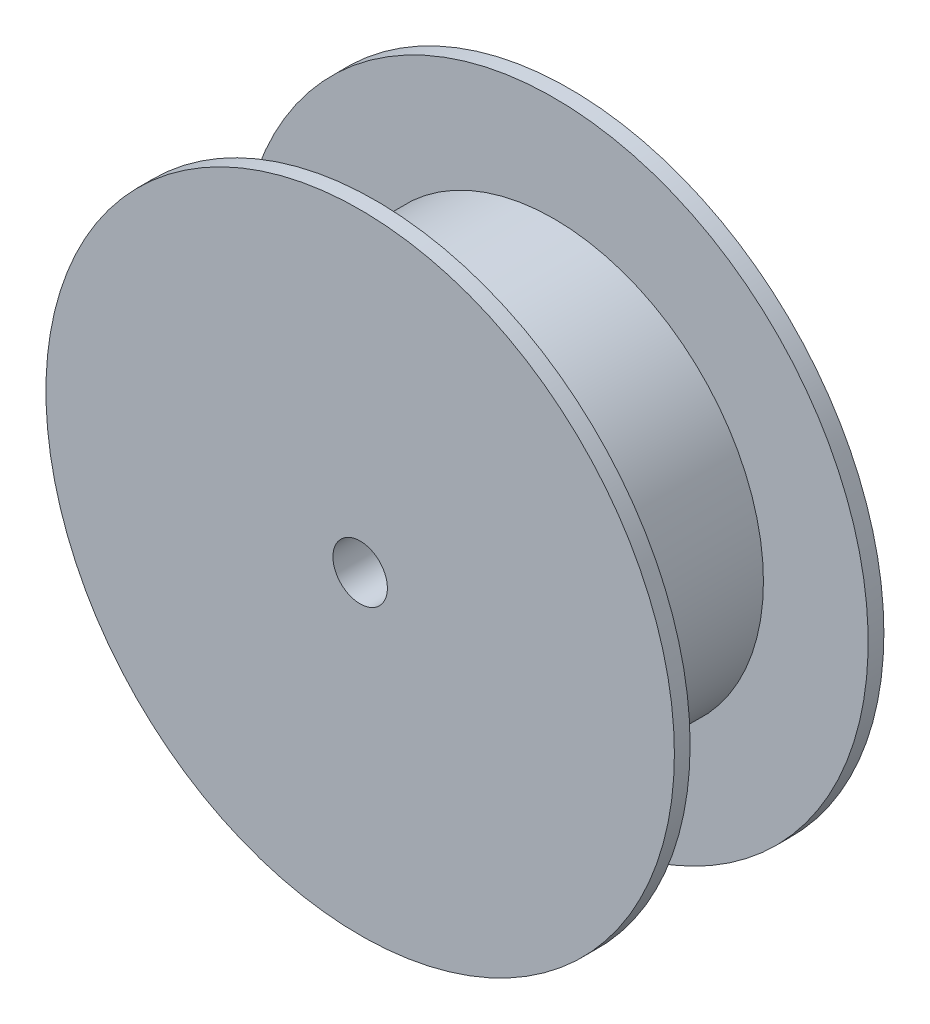
ISO-10303-21;
HEADER;
FILE_DESCRIPTION(('STEP AP214'),'2;1');
FILE_NAME('part.step','',(''),(''),'','','');
FILE_SCHEMA(('AUTOMOTIVE_DESIGN { 1 0 10303 214 1 1 1 1 }'));
ENDSEC;
DATA;
#1=APPLICATION_CONTEXT('core data for automotive mechanical design processes');
#2=APPLICATION_PROTOCOL_DEFINITION('international standard','automotive_design',2000,#1);
#3=PRODUCT_CONTEXT('',#1,'mechanical');
#4=PRODUCT('Part','Part','',(#3));
#5=PRODUCT_RELATED_PRODUCT_CATEGORY('part','',(#4));
#6=PRODUCT_DEFINITION_FORMATION('','',#4);
#7=PRODUCT_DEFINITION_CONTEXT('part definition',#1,'design');
#8=PRODUCT_DEFINITION('design','',#6,#7);
#9=PRODUCT_DEFINITION_SHAPE('','',#8);
#10=(LENGTH_UNIT() NAMED_UNIT(*) SI_UNIT(.MILLI.,.METRE.));
#11=(NAMED_UNIT(*) PLANE_ANGLE_UNIT() SI_UNIT($,.RADIAN.));
#12=(NAMED_UNIT(*) SI_UNIT($,.STERADIAN.) SOLID_ANGLE_UNIT());
#13=UNCERTAINTY_MEASURE_WITH_UNIT(LENGTH_MEASURE(1.E-05),#10,'distance_accuracy_value','');
#14=(GEOMETRIC_REPRESENTATION_CONTEXT(3) GLOBAL_UNCERTAINTY_ASSIGNED_CONTEXT((#13)) GLOBAL_UNIT_ASSIGNED_CONTEXT((#10,
#11,#12)) REPRESENTATION_CONTEXT('',''));
#15=CARTESIAN_POINT('',(0.,0.,0.));
#16=DIRECTION('',(0.,0.,1.));
#17=DIRECTION('',(1.,0.,0.));
#18=AXIS2_PLACEMENT_3D('',#15,#16,#17);
#19=CARTESIAN_POINT('',(0.,0.,8.5));
#20=DIRECTION('',(0.,0.,1.));
#21=DIRECTION('',(1.,0.,0.));
#22=AXIS2_PLACEMENT_3D('',#19,#20,#21);
#23=PLANE('',#22);
#24=CARTESIAN_POINT('',(0.,0.,8.5));
#25=DIRECTION('',(0.,0.,1.));
#26=DIRECTION('',(1.,0.,0.));
#27=AXIS2_PLACEMENT_3D('',#24,#25,#26);
#28=CIRCLE('',#27,20.);
#29=CARTESIAN_POINT('',(20.,0.,8.5));
#30=VERTEX_POINT('',#29);
#31=EDGE_CURVE('E61',#30,#30,#28,.T.);
#32=ORIENTED_EDGE('',*,*,#31,.T.);
#33=EDGE_LOOP('',(#32));
#34=FACE_BOUND('',#33,.T.);
#35=CARTESIAN_POINT('',(0.,0.,8.5));
#36=DIRECTION('',(0.,0.,1.));
#37=DIRECTION('',(1.,0.,0.));
#38=AXIS2_PLACEMENT_3D('',#35,#36,#37);
#39=CIRCLE('',#38,30.);
#40=CARTESIAN_POINT('',(30.,0.,8.5));
#41=VERTEX_POINT('',#40);
#42=EDGE_CURVE('E58',#41,#41,#39,.T.);
#43=ORIENTED_EDGE('',*,*,#42,.F.);
#44=EDGE_LOOP('',(#43));
#45=FACE_BOUND('',#44,.T.);
#46=ADVANCED_FACE('F43',(#34,#45),#23,.F.);
#47=CARTESIAN_POINT('',(0.,0.,1.5));
#48=DIRECTION('',(0.,0.,1.));
#49=DIRECTION('',(1.,0.,0.));
#50=AXIS2_PLACEMENT_3D('',#47,#48,#49);
#51=CYLINDRICAL_SURFACE('',#50,20.);
#52=ORIENTED_EDGE('',*,*,#31,.F.);
#53=EDGE_LOOP('',(#52));
#54=FACE_BOUND('',#53,.T.);
#55=CARTESIAN_POINT('',(0.,0.,-8.5));
#56=DIRECTION('',(0.,0.,1.));
#57=DIRECTION('',(1.,0.,0.));
#58=AXIS2_PLACEMENT_3D('',#55,#56,#57);
#59=CIRCLE('',#58,20.);
#60=CARTESIAN_POINT('',(20.,0.,-8.5));
#61=VERTEX_POINT('',#60);
#62=EDGE_CURVE('E73',#61,#61,#59,.T.);
#63=ORIENTED_EDGE('',*,*,#62,.T.);
#64=EDGE_LOOP('',(#63));
#65=FACE_BOUND('',#64,.T.);
#66=ADVANCED_FACE('F108',(#54,#65),#51,.T.);
#67=CARTESIAN_POINT('',(0.,0.,10.));
#68=DIRECTION('',(0.,0.,1.));
#69=DIRECTION('',(1.,0.,0.));
#70=AXIS2_PLACEMENT_3D('',#67,#68,#69);
#71=PLANE('',#70);
#72=CARTESIAN_POINT('',(0.,0.,10.));
#73=DIRECTION('',(0.,0.,-1.));
#74=DIRECTION('',(-1.,0.,0.));
#75=AXIS2_PLACEMENT_3D('',#72,#73,#74);
#76=CIRCLE('',#75,2.6);
#77=CARTESIAN_POINT('',(-2.6,0.,10.));
#78=VERTEX_POINT('',#77);
#79=EDGE_CURVE('E78',#78,#78,#76,.T.);
#80=ORIENTED_EDGE('',*,*,#79,.T.);
#81=EDGE_LOOP('',(#80));
#82=FACE_BOUND('',#81,.T.);
#83=CARTESIAN_POINT('',(0.,0.,10.));
#84=DIRECTION('',(0.,0.,1.));
#85=DIRECTION('',(1.,0.,0.));
#86=AXIS2_PLACEMENT_3D('',#83,#84,#85);
#87=CIRCLE('',#86,30.);
#88=CARTESIAN_POINT('',(30.,0.,10.));
#89=VERTEX_POINT('',#88);
#90=EDGE_CURVE('E11',#89,#89,#87,.T.);
#91=ORIENTED_EDGE('',*,*,#90,.T.);
#92=EDGE_LOOP('',(#91));
#93=FACE_BOUND('',#92,.T.);
#94=ADVANCED_FACE('F106',(#82,#93),#71,.T.);
#95=CARTESIAN_POINT('',(0.,0.,10.));
#96=DIRECTION('',(0.,0.,-1.));
#97=DIRECTION('',(-1.,0.,0.));
#98=AXIS2_PLACEMENT_3D('',#95,#96,#97);
#99=CYLINDRICAL_SURFACE('',#98,30.);
#100=ORIENTED_EDGE('',*,*,#42,.T.);
#101=EDGE_LOOP('',(#100));
#102=FACE_BOUND('',#101,.T.);
#103=ORIENTED_EDGE('',*,*,#90,.F.);
#104=EDGE_LOOP('',(#103));
#105=FACE_BOUND('',#104,.T.);
#106=ADVANCED_FACE('F45',(#102,#105),#99,.T.);
#107=CARTESIAN_POINT('',(0.,0.,-8.5));
#108=DIRECTION('',(0.,0.,-1.));
#109=DIRECTION('',(-1.,0.,0.));
#110=AXIS2_PLACEMENT_3D('',#107,#108,#109);
#111=PLANE('',#110);
#112=ORIENTED_EDGE('',*,*,#62,.F.);
#113=EDGE_LOOP('',(#112));
#114=FACE_BOUND('',#113,.T.);
#115=CARTESIAN_POINT('',(0.,0.,-8.5));
#116=DIRECTION('',(0.,0.,-1.));
#117=DIRECTION('',(-1.,0.,0.));
#118=AXIS2_PLACEMENT_3D('',#115,#116,#117);
#119=CIRCLE('',#118,30.);
#120=CARTESIAN_POINT('',(-30.,0.,-8.5));
#121=VERTEX_POINT('',#120);
#122=EDGE_CURVE('E47',#121,#121,#119,.T.);
#123=ORIENTED_EDGE('',*,*,#122,.F.);
#124=EDGE_LOOP('',(#123));
#125=FACE_BOUND('',#124,.T.);
#126=ADVANCED_FACE('F96',(#114,#125),#111,.F.);
#127=CARTESIAN_POINT('',(0.,0.,-10.));
#128=DIRECTION('',(0.,0.,1.));
#129=DIRECTION('',(1.,0.,0.));
#130=AXIS2_PLACEMENT_3D('',#127,#128,#129);
#131=PLANE('',#130);
#132=CARTESIAN_POINT('',(0.,0.,-10.));
#133=DIRECTION('',(0.,0.,-1.));
#134=DIRECTION('',(-1.,0.,0.));
#135=AXIS2_PLACEMENT_3D('',#132,#133,#134);
#136=CIRCLE('',#135,2.6);
#137=CARTESIAN_POINT('',(-2.6,0.,-10.));
#138=VERTEX_POINT('',#137);
#139=EDGE_CURVE('E83',#138,#138,#136,.T.);
#140=ORIENTED_EDGE('',*,*,#139,.F.);
#141=EDGE_LOOP('',(#140));
#142=FACE_BOUND('',#141,.T.);
#143=CARTESIAN_POINT('',(0.,0.,-10.));
#144=DIRECTION('',(0.,0.,1.));
#145=DIRECTION('',(1.,0.,0.));
#146=AXIS2_PLACEMENT_3D('',#143,#144,#145);
#147=CIRCLE('',#146,30.);
#148=CARTESIAN_POINT('',(30.,0.,-10.));
#149=VERTEX_POINT('',#148);
#150=EDGE_CURVE('E52',#149,#149,#147,.T.);
#151=ORIENTED_EDGE('',*,*,#150,.F.);
#152=EDGE_LOOP('',(#151));
#153=FACE_BOUND('',#152,.T.);
#154=ADVANCED_FACE('F92',(#142,#153),#131,.F.);
#155=ORIENTED_EDGE('',*,*,#122,.T.);
#156=EDGE_LOOP('',(#155));
#157=FACE_BOUND('',#156,.T.);
#158=ORIENTED_EDGE('',*,*,#150,.T.);
#159=EDGE_LOOP('',(#158));
#160=FACE_BOUND('',#159,.T.);
#161=ADVANCED_FACE('F95',(#157,#160),#99,.T.);
#162=CARTESIAN_POINT('',(0.,0.,10.));
#163=DIRECTION('',(0.,0.,-1.));
#164=DIRECTION('',(-1.,0.,0.));
#165=AXIS2_PLACEMENT_3D('',#162,#163,#164);
#166=CYLINDRICAL_SURFACE('',#165,2.6);
#167=ORIENTED_EDGE('',*,*,#79,.F.);
#168=EDGE_LOOP('',(#167));
#169=FACE_BOUND('',#168,.T.);
#170=ORIENTED_EDGE('',*,*,#139,.T.);
#171=EDGE_LOOP('',(#170));
#172=FACE_BOUND('',#171,.T.);
#173=ADVANCED_FACE('F90',(#169,#172),#166,.F.);
#174=CLOSED_SHELL('',(#46,#66,#94,#106,#126,#154,#161,#173));
#175=MANIFOLD_SOLID_BREP('B2',#174);
#176=ADVANCED_BREP_SHAPE_REPRESENTATION('',(#18,#175),#14);
#177=SHAPE_DEFINITION_REPRESENTATION(#9,#176);
ENDSEC;
END-ISO-10303-21;
